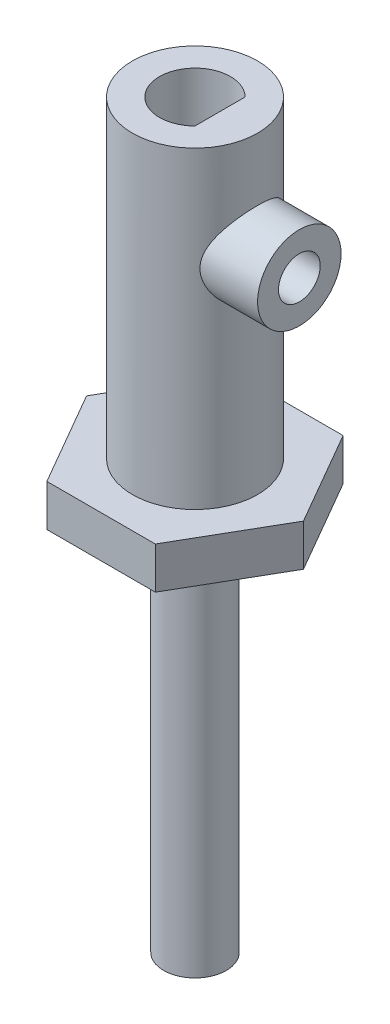
ISO-10303-21;
HEADER;
FILE_DESCRIPTION(('STEP AP214'),'2;1');
FILE_NAME('part.step','',(''),(''),'','','');
FILE_SCHEMA(('AUTOMOTIVE_DESIGN { 1 0 10303 214 1 1 1 1 }'));
ENDSEC;
DATA;
#1=APPLICATION_CONTEXT('core data for automotive mechanical design processes');
#2=APPLICATION_PROTOCOL_DEFINITION('international standard','automotive_design',2000,#1);
#3=PRODUCT_CONTEXT('',#1,'mechanical');
#4=PRODUCT('Part','Part','',(#3));
#5=PRODUCT_RELATED_PRODUCT_CATEGORY('part','',(#4));
#6=PRODUCT_DEFINITION_FORMATION('','',#4);
#7=PRODUCT_DEFINITION_CONTEXT('part definition',#1,'design');
#8=PRODUCT_DEFINITION('design','',#6,#7);
#9=PRODUCT_DEFINITION_SHAPE('','',#8);
#10=(LENGTH_UNIT() NAMED_UNIT(*) SI_UNIT(.MILLI.,.METRE.));
#11=(NAMED_UNIT(*) PLANE_ANGLE_UNIT() SI_UNIT($,.RADIAN.));
#12=(NAMED_UNIT(*) SI_UNIT($,.STERADIAN.) SOLID_ANGLE_UNIT());
#13=UNCERTAINTY_MEASURE_WITH_UNIT(LENGTH_MEASURE(1.E-05),#10,'distance_accuracy_value','');
#14=(GEOMETRIC_REPRESENTATION_CONTEXT(3) GLOBAL_UNCERTAINTY_ASSIGNED_CONTEXT((#13)) GLOBAL_UNIT_ASSIGNED_CONTEXT((#10,
#11,#12)) REPRESENTATION_CONTEXT('',''));
#15=CARTESIAN_POINT('',(0.,0.,0.));
#16=DIRECTION('',(0.,0.,1.));
#17=DIRECTION('',(1.,0.,0.));
#18=AXIS2_PLACEMENT_3D('',#15,#16,#17);
#19=CARTESIAN_POINT('',(0.,17.,0.));
#20=DIRECTION('',(0.,-1.,0.));
#21=DIRECTION('',(0.,0.,-1.));
#22=AXIS2_PLACEMENT_3D('',#19,#20,#21);
#23=CYLINDRICAL_SURFACE('',#22,3.);
#24=CARTESIAN_POINT('',(2.23606797749979,12.,-2.));
#25=CARTESIAN_POINT('',(2.23607753462817,11.9023716891314,-1.99999453997731));
#26=CARTESIAN_POINT('',(2.24258071047442,11.8047092462912,-1.99278992503664));
#27=CARTESIAN_POINT('',(2.26731972501617,11.6128800883492,-1.96458268317731));
#28=CARTESIAN_POINT('',(2.2855766081271,11.5187199644704,-1.94355530587862));
#29=CARTESIAN_POINT('',(2.3305658582557,11.3372645581223,-1.88935861676632));
#30=CARTESIAN_POINT('',(2.35721561794602,11.2499123032623,-1.85630718014214));
#31=CARTESIAN_POINT('',(2.41584094681825,11.0821341676533,-1.77934008393538));
#32=CARTESIAN_POINT('',(2.44781762158831,11.0017097300235,-1.73542216812163));
#33=CARTESIAN_POINT('',(2.51946072932026,10.8363531123831,-1.63002410007714));
#34=CARTESIAN_POINT('',(2.55954936090364,10.7526678822828,-1.56687435451732));
#35=CARTESIAN_POINT('',(2.63944827308083,10.5959972911257,-1.4281921974068));
#36=CARTESIAN_POINT('',(2.67925824297985,10.5230224783415,-1.3526477317708));
#37=CARTESIAN_POINT('',(2.76088818523747,10.3793563412183,-1.17815690494295));
#38=CARTESIAN_POINT('',(2.80216785846923,10.3105174882243,-1.07740643965819));
#39=CARTESIAN_POINT('',(2.87558484482764,10.1913579045099,-0.862470964212232));
#40=CARTESIAN_POINT('',(2.90773236231037,10.1410164859688,-0.748301152321704));
#41=CARTESIAN_POINT('',(2.95599907464725,10.0664435989825,-0.523249073480004));
#42=CARTESIAN_POINT('',(2.97351175615867,10.0399166555044,-0.413434725181417));
#43=CARTESIAN_POINT('',(2.99609745461921,10.0058155107164,-0.189695448729863));
#44=CARTESIAN_POINT('',(3.00118613762359,9.99821744077456,-0.075775881285826));
#45=CARTESIAN_POINT('',(2.99855361722953,10.0021724499491,0.134147050232329));
#46=CARTESIAN_POINT('',(2.99266264910127,10.0109890513171,0.230240638008752));
#47=CARTESIAN_POINT('',(2.9720818279002,10.0420910513589,0.419238633271014));
#48=CARTESIAN_POINT('',(2.95739133313102,10.0643774323035,0.512142807649723));
#49=CARTESIAN_POINT('',(2.92052091703736,10.1211956847946,0.692077937671168));
#50=CARTESIAN_POINT('',(2.89837077982679,10.1556788851986,0.77913062384596));
#51=CARTESIAN_POINT('',(2.84821104476288,10.2355536429528,0.946209150653555));
#52=CARTESIAN_POINT('',(2.82020037745161,10.2809471915015,1.0262337049694));
#53=CARTESIAN_POINT('',(2.75618058450702,10.3879787374599,1.18828429196344));
#54=CARTESIAN_POINT('',(2.71960408792025,10.4509675233528,1.26919148099708));
#55=CARTESIAN_POINT('',(2.64400601826998,10.5878986794803,1.41998807498304));
#56=CARTESIAN_POINT('',(2.60498072815232,10.6618579459338,1.48986013519457));
#57=CARTESIAN_POINT('',(2.52150044944152,10.8319632102133,1.62772235326165));
#58=CARTESIAN_POINT('',(2.47714320008932,10.9297710797145,1.69373593126354));
#59=CARTESIAN_POINT('',(2.39475610831096,11.1375098392207,1.80834874945482));
#60=CARTESIAN_POINT('',(2.3567157153489,11.2474199944139,1.85697718654898));
#61=CARTESIAN_POINT('',(2.30262870306889,11.4447190620731,1.92332724567776));
#62=CARTESIAN_POINT('',(2.28340364577668,11.5295933700569,1.94590791747533));
#63=CARTESIAN_POINT('',(2.25409039789612,11.7030394898168,1.97979555580014));
#64=CARTESIAN_POINT('',(2.24398636782354,11.7916046111726,1.99112206964395));
#65=CARTESIAN_POINT('',(2.23447556987372,11.9704429864415,2.00179400148877));
#66=CARTESIAN_POINT('',(2.2351153386647,12.0607219785201,2.00108729753098));
#67=CARTESIAN_POINT('',(2.24709880368953,12.239683833955,1.98761629716365));
#68=CARTESIAN_POINT('',(2.25845117648851,12.3283653441074,1.97484222690381));
#69=CARTESIAN_POINT('',(2.28927977500747,12.4973894175498,1.93899811187046));
#70=CARTESIAN_POINT('',(2.30833187069749,12.5779277090026,1.91646174529973));
#71=CARTESIAN_POINT('',(2.3522995853365,12.7341262360503,1.86223041628513));
#72=CARTESIAN_POINT('',(2.3772171729463,12.809784822963,1.83053237805351));
#73=CARTESIAN_POINT('',(2.43611483596194,12.9702020038475,1.75163346599563));
#74=CARTESIAN_POINT('',(2.47091081434316,13.0537568115427,1.70260028818246));
#75=CARTESIAN_POINT('',(2.54262514806634,13.2124168026173,1.59352731501438));
#76=CARTESIAN_POINT('',(2.57954604947543,13.2875115167425,1.53347411883827));
#77=CARTESIAN_POINT('',(2.66075678321007,13.4439623474675,1.38876657712435));
#78=CARTESIAN_POINT('',(2.70489452138573,13.5231028482483,1.30160386514207));
#79=CARTESIAN_POINT('',(2.78775581841638,13.6658166829403,1.11309948866219));
#80=CARTESIAN_POINT('',(2.82648414789457,13.7294037712567,1.011770477457));
#81=CARTESIAN_POINT('',(2.88790821242222,13.8278917389176,0.817487474821797));
#82=CARTESIAN_POINT('',(2.91225458111008,13.8659565044404,0.726662364886321));
#83=CARTESIAN_POINT('',(2.95278707867041,13.9286071943204,0.538757079020515));
#84=CARTESIAN_POINT('',(2.96898009871993,13.9532045028598,0.441682263858769));
#85=CARTESIAN_POINT('',(2.99178364026746,13.9876969638388,0.243369392303442));
#86=CARTESIAN_POINT('',(2.99835150856533,13.9975266795067,0.142114836924317));
#87=CARTESIAN_POINT('',(3.00109821029056,14.0016478514171,-0.0608555465807329));
#88=CARTESIAN_POINT('',(2.99727800938901,13.9959407519562,-0.162571330953448));
#89=CARTESIAN_POINT('',(2.98029555977324,13.9703405109953,-0.355757532528106));
#90=CARTESIAN_POINT('',(2.96783277209856,13.9515090151382,-0.447435143070531));
#91=CARTESIAN_POINT('',(2.93536106206933,13.9017619905691,-0.626018422997062));
#92=CARTESIAN_POINT('',(2.91535096747103,13.8708445846527,-0.71292334868689));
#93=CARTESIAN_POINT('',(2.86791765486194,13.796061295116,-0.885147296608352));
#94=CARTESIAN_POINT('',(2.84013248946338,13.7515496925049,-0.970083589200266));
#95=CARTESIAN_POINT('',(2.77975408235472,13.651849355374,-1.13155266268318));
#96=CARTESIAN_POINT('',(2.74715796645263,13.596654232048,-1.20808037205002));
#97=CARTESIAN_POINT('',(2.67392931472394,13.4673710976637,-1.36329422201402));
#98=CARTESIAN_POINT('',(2.6328391387737,13.391676976326,-1.44042679526091));
#99=CARTESIAN_POINT('',(2.55053357649486,13.2288864584542,-1.58160022281596));
#100=CARTESIAN_POINT('',(2.50931811970154,13.1417816111659,-1.64563128323923));
#101=CARTESIAN_POINT('',(2.43384213590298,12.9641324092447,-1.75513253518411));
#102=CARTESIAN_POINT('',(2.39929086741904,12.8743581900497,-1.8016464689721));
#103=CARTESIAN_POINT('',(2.33747501591023,12.6867155510068,-1.88115802340272));
#104=CARTESIAN_POINT('',(2.31019631295305,12.5888633061378,-1.91418190281333));
#105=CARTESIAN_POINT('',(2.27191051929539,12.4092285315755,-1.95936262470908));
#106=CARTESIAN_POINT('',(2.25863695410151,12.3286917632097,-1.97452228373248));
#107=CARTESIAN_POINT('',(2.24071519216009,12.1654435994955,-1.99483915818926));
#108=CARTESIAN_POINT('',(2.23605987841475,12.0827340557394,-2.00000462703715));
#109=CARTESIAN_POINT('',(2.23606797749979,12.,-2.));
#110=B_SPLINE_CURVE_WITH_KNOTS('',3,(#24,#25,#26,#27,#28,#29,#30,#31,#32,#33,#34,#35,#36,#37,
#38,#39,#40,#41,#42,#43,#44,#45,#46,#47,#48,#49,#50,#51,#52,#53,#54,#55,#56,#57,#58,#59,#60,#61,
#62,#63,#64,#65,#66,#67,#68,#69,#70,#71,#72,#73,#74,#75,#76,#77,#78,#79,#80,#81,#82,#83,#84,#85,
#86,#87,#88,#89,#90,#91,#92,#93,#94,#95,#96,#97,#98,#99,#100,#101,#102,#103,#104,#105,#106,#107,
#108,#109),.UNSPECIFIED.,.T.,.F.,(4,2,2,2,2,2,2,2,2,2,2,2,2,2,2,2,2,2,2,2,2,2,2,2,2,2,2,2,2,2,2,
2,2,2,2,2,2,2,2,2,2,2,4),(0.,0.292506930722154,0.585539042259288,0.875772651216272,
1.16606657266549,1.50154677068638,1.83735518436276,2.22167031006289,2.6055542938858,
2.94637482063579,3.28676536688298,3.57539534955742,3.86404638283746,4.15155831973191,
4.43912276903,4.76447525946635,5.09033414796638,5.46678703504943,5.84260469743948,
6.11126090401324,6.37944966235486,6.64880037638036,6.91836943570597,7.17476451706936,
7.43124577644957,7.73899230052352,8.04711556801509,8.42254684520963,8.7976449057258,
9.10070580611698,9.40351012888472,9.70765229266164,10.0117661844615,10.2937678224973,
10.5758132789284,10.874178629859,11.1727229593109,11.5182220628451,11.863978504186,
12.1833412579672,12.5020793664923,12.7501661630426,12.9980479966543),.UNSPECIFIED.);
#111=CARTESIAN_POINT('',(2.23606797749979,12.,-2.));
#112=VERTEX_POINT('',#111);
#113=EDGE_CURVE('E184',#112,#112,#110,.T.);
#114=ORIENTED_EDGE('',*,*,#113,.T.);
#115=EDGE_LOOP('',(#114));
#116=FACE_BOUND('',#115,.T.);
#117=CARTESIAN_POINT('',(0.,17.,0.));
#118=DIRECTION('',(0.,1.,0.));
#119=DIRECTION('',(0.,0.,1.));
#120=AXIS2_PLACEMENT_3D('',#117,#118,#119);
#121=CIRCLE('',#120,3.);
#122=CARTESIAN_POINT('',(0.,17.,3.));
#123=VERTEX_POINT('',#122);
#124=EDGE_CURVE('E179',#123,#123,#121,.T.);
#125=ORIENTED_EDGE('',*,*,#124,.F.);
#126=EDGE_LOOP('',(#125));
#127=FACE_BOUND('',#126,.T.);
#128=CARTESIAN_POINT('',(0.,2.,0.));
#129=DIRECTION('',(0.,-1.,0.));
#130=DIRECTION('',(0.,0.,-1.));
#131=AXIS2_PLACEMENT_3D('',#128,#129,#130);
#132=CIRCLE('',#131,3.);
#133=CARTESIAN_POINT('',(0.,2.,-3.));
#134=VERTEX_POINT('',#133);
#135=EDGE_CURVE('E43',#134,#134,#132,.T.);
#136=ORIENTED_EDGE('',*,*,#135,.F.);
#137=EDGE_LOOP('',(#136));
#138=FACE_BOUND('',#137,.T.);
#139=ADVANCED_FACE('F34',(#116,#127,#138),#23,.T.);
#140=CARTESIAN_POINT('',(0.,17.,0.));
#141=DIRECTION('',(0.,1.,0.));
#142=DIRECTION('',(0.,0.,1.));
#143=AXIS2_PLACEMENT_3D('',#140,#141,#142);
#144=PLANE('',#143);
#145=CARTESIAN_POINT('',(0.,17.,0.));
#146=DIRECTION('',(0.,1.,0.));
#147=DIRECTION('',(0.,0.,1.));
#148=AXIS2_PLACEMENT_3D('',#145,#146,#147);
#149=CIRCLE('',#148,1.7);
#150=CARTESIAN_POINT('',(1.2,17.,-1.20415945787923));
#151=VERTEX_POINT('',#150);
#152=CARTESIAN_POINT('',(1.2,17.,1.20415945787923));
#153=VERTEX_POINT('',#152);
#154=EDGE_CURVE('E51',#151,#153,#149,.T.);
#155=ORIENTED_EDGE('',*,*,#154,.F.);
#156=DIRECTION('',(0.,0.,-1.));
#157=VECTOR('',#156,1.);
#158=CARTESIAN_POINT('',(1.2,17.,-1.20415945787923));
#159=LINE('',#158,#157);
#160=EDGE_CURVE('E172',#153,#151,#159,.T.);
#161=ORIENTED_EDGE('',*,*,#160,.F.);
#162=EDGE_LOOP('',(#155,#161));
#163=FACE_BOUND('',#162,.T.);
#164=ORIENTED_EDGE('',*,*,#124,.T.);
#165=EDGE_LOOP('',(#164));
#166=FACE_BOUND('',#165,.T.);
#167=ADVANCED_FACE('F239',(#163,#166),#144,.T.);
#168=CARTESIAN_POINT('',(0.,6.8,0.));
#169=DIRECTION('',(0.,1.,0.));
#170=DIRECTION('',(0.,0.,1.));
#171=AXIS2_PLACEMENT_3D('',#168,#169,#170);
#172=CYLINDRICAL_SURFACE('',#171,1.7);
#173=ORIENTED_EDGE('',*,*,#154,.T.);
#174=DIRECTION('',(0.,1.,0.));
#175=VECTOR('',#174,1.);
#176=CARTESIAN_POINT('',(1.2,6.8,1.20415945787923));
#177=LINE('',#176,#175);
#178=CARTESIAN_POINT('',(1.2,6.8,1.20415945787923));
#179=VERTEX_POINT('',#178);
#180=EDGE_CURVE('E175',#179,#153,#177,.T.);
#181=ORIENTED_EDGE('',*,*,#180,.F.);
#182=CARTESIAN_POINT('',(0.,6.8,0.));
#183=DIRECTION('',(0.,1.,0.));
#184=DIRECTION('',(0.,0.,1.));
#185=AXIS2_PLACEMENT_3D('',#182,#183,#184);
#186=CIRCLE('',#185,1.7);
#187=CARTESIAN_POINT('',(1.2,6.8,-1.20415945787923));
#188=VERTEX_POINT('',#187);
#189=EDGE_CURVE('E168',#188,#179,#186,.T.);
#190=ORIENTED_EDGE('',*,*,#189,.F.);
#191=DIRECTION('',(0.,1.,0.));
#192=VECTOR('',#191,1.);
#193=CARTESIAN_POINT('',(1.2,6.8,-1.20415945787923));
#194=LINE('',#193,#192);
#195=EDGE_CURVE('E59',#188,#151,#194,.T.);
#196=ORIENTED_EDGE('',*,*,#195,.T.);
#197=EDGE_LOOP('',(#173,#181,#190,#196));
#198=FACE_BOUND('',#197,.T.);
#199=ADVANCED_FACE('F235',(#198),#172,.F.);
#200=CARTESIAN_POINT('',(1.2,6.8,-1.20415945787923));
#201=DIRECTION('',(1.,0.,0.));
#202=DIRECTION('',(0.,0.,-1.));
#203=AXIS2_PLACEMENT_3D('',#200,#201,#202);
#204=PLANE('',#203);
#205=CARTESIAN_POINT('',(1.2,12.,0.));
#206=DIRECTION('',(1.,0.,0.));
#207=DIRECTION('',(0.,0.,-1.));
#208=AXIS2_PLACEMENT_3D('',#205,#206,#207);
#209=CIRCLE('',#208,1.1);
#210=CARTESIAN_POINT('',(1.2,12.,-1.1));
#211=VERTEX_POINT('',#210);
#212=EDGE_CURVE('E38',#211,#211,#209,.T.);
#213=ORIENTED_EDGE('',*,*,#212,.T.);
#214=EDGE_LOOP('',(#213));
#215=FACE_BOUND('',#214,.T.);
#216=ORIENTED_EDGE('',*,*,#160,.T.);
#217=ORIENTED_EDGE('',*,*,#195,.F.);
#218=DIRECTION('',(0.,0.,-1.));
#219=VECTOR('',#218,1.);
#220=CARTESIAN_POINT('',(1.2,6.8,-1.20415945787923));
#221=LINE('',#220,#219);
#222=EDGE_CURVE('E171',#179,#188,#221,.T.);
#223=ORIENTED_EDGE('',*,*,#222,.F.);
#224=ORIENTED_EDGE('',*,*,#180,.T.);
#225=EDGE_LOOP('',(#216,#217,#223,#224));
#226=FACE_BOUND('',#225,.T.);
#227=ADVANCED_FACE('F231',(#215,#226),#204,.F.);
#228=CARTESIAN_POINT('',(0.,6.8,0.));
#229=DIRECTION('',(0.,1.,0.));
#230=DIRECTION('',(0.,0.,1.));
#231=AXIS2_PLACEMENT_3D('',#228,#229,#230);
#232=PLANE('',#231);
#233=ORIENTED_EDGE('',*,*,#189,.T.);
#234=ORIENTED_EDGE('',*,*,#222,.T.);
#235=EDGE_LOOP('',(#233,#234));
#236=FACE_BOUND('',#235,.T.);
#237=ADVANCED_FACE('F228',(#236),#232,.T.);
#238=CARTESIAN_POINT('',(-2.59807621135332,2.,4.5));
#239=DIRECTION('',(-0.866025403784439,0.,0.5));
#240=DIRECTION('',(0.5,0.,0.866025403784439));
#241=AXIS2_PLACEMENT_3D('',#238,#239,#240);
#242=PLANE('',#241);
#243=DIRECTION('',(-0.5,0.,-0.866025403784439));
#244=VECTOR('',#243,1.);
#245=CARTESIAN_POINT('',(-2.59807621135332,0.,4.5));
#246=LINE('',#245,#244);
#247=CARTESIAN_POINT('',(-2.59807621135332,0.,4.5));
#248=VERTEX_POINT('',#247);
#249=CARTESIAN_POINT('',(-5.19615242270663,0.,0.));
#250=VERTEX_POINT('',#249);
#251=EDGE_CURVE('E145',#248,#250,#246,.T.);
#252=ORIENTED_EDGE('',*,*,#251,.F.);
#253=DIRECTION('',(0.,-1.,0.));
#254=VECTOR('',#253,1.);
#255=CARTESIAN_POINT('',(-2.59807621135332,2.,4.5));
#256=LINE('',#255,#254);
#257=CARTESIAN_POINT('',(-2.59807621135332,2.,4.5));
#258=VERTEX_POINT('',#257);
#259=EDGE_CURVE('E72',#258,#248,#256,.T.);
#260=ORIENTED_EDGE('',*,*,#259,.F.);
#261=DIRECTION('',(-0.5,0.,-0.866025403784439));
#262=VECTOR('',#261,1.);
#263=CARTESIAN_POINT('',(-2.59807621135332,2.,4.5));
#264=LINE('',#263,#262);
#265=CARTESIAN_POINT('',(-5.19615242270663,2.,0.));
#266=VERTEX_POINT('',#265);
#267=EDGE_CURVE('E161',#258,#266,#264,.T.);
#268=ORIENTED_EDGE('',*,*,#267,.T.);
#269=DIRECTION('',(0.,-1.,0.));
#270=VECTOR('',#269,1.);
#271=CARTESIAN_POINT('',(-5.19615242270663,2.,0.));
#272=LINE('',#271,#270);
#273=EDGE_CURVE('E104',#266,#250,#272,.T.);
#274=ORIENTED_EDGE('',*,*,#273,.T.);
#275=EDGE_LOOP('',(#252,#260,#268,#274));
#276=FACE_BOUND('',#275,.T.);
#277=ADVANCED_FACE('F215',(#276),#242,.T.);
#278=CARTESIAN_POINT('',(2.59807621135332,2.,4.5));
#279=DIRECTION('',(0.,0.,1.));
#280=DIRECTION('',(1.,0.,0.));
#281=AXIS2_PLACEMENT_3D('',#278,#279,#280);
#282=PLANE('',#281);
#283=DIRECTION('',(-1.,0.,0.));
#284=VECTOR('',#283,1.);
#285=CARTESIAN_POINT('',(2.59807621135332,0.,4.5));
#286=LINE('',#285,#284);
#287=CARTESIAN_POINT('',(2.59807621135332,0.,4.5));
#288=VERTEX_POINT('',#287);
#289=EDGE_CURVE('E158',#288,#248,#286,.T.);
#290=ORIENTED_EDGE('',*,*,#289,.F.);
#291=DIRECTION('',(0.,-1.,0.));
#292=VECTOR('',#291,1.);
#293=CARTESIAN_POINT('',(2.59807621135332,2.,4.5));
#294=LINE('',#293,#292);
#295=CARTESIAN_POINT('',(2.59807621135332,2.,4.5));
#296=VERTEX_POINT('',#295);
#297=EDGE_CURVE('E126',#296,#288,#294,.T.);
#298=ORIENTED_EDGE('',*,*,#297,.F.);
#299=DIRECTION('',(-1.,0.,0.));
#300=VECTOR('',#299,1.);
#301=CARTESIAN_POINT('',(2.59807621135332,2.,4.5));
#302=LINE('',#301,#300);
#303=EDGE_CURVE('E135',#296,#258,#302,.T.);
#304=ORIENTED_EDGE('',*,*,#303,.T.);
#305=ORIENTED_EDGE('',*,*,#259,.T.);
#306=EDGE_LOOP('',(#290,#298,#304,#305));
#307=FACE_BOUND('',#306,.T.);
#308=ADVANCED_FACE('F212',(#307),#282,.T.);
#309=CARTESIAN_POINT('',(5.19615242270663,2.,0.));
#310=DIRECTION('',(0.866025403784438,0.,0.5));
#311=DIRECTION('',(0.5,0.,-0.866025403784439));
#312=AXIS2_PLACEMENT_3D('',#309,#310,#311);
#313=PLANE('',#312);
#314=DIRECTION('',(-0.5,0.,0.866025403784438));
#315=VECTOR('',#314,1.);
#316=CARTESIAN_POINT('',(5.19615242270663,0.,0.));
#317=LINE('',#316,#315);
#318=CARTESIAN_POINT('',(5.19615242270663,0.,0.));
#319=VERTEX_POINT('',#318);
#320=EDGE_CURVE('E121',#319,#288,#317,.T.);
#321=ORIENTED_EDGE('',*,*,#320,.F.);
#322=DIRECTION('',(0.,-1.,0.));
#323=VECTOR('',#322,1.);
#324=CARTESIAN_POINT('',(5.19615242270663,2.,0.));
#325=LINE('',#324,#323);
#326=CARTESIAN_POINT('',(5.19615242270663,2.,0.));
#327=VERTEX_POINT('',#326);
#328=EDGE_CURVE('E115',#327,#319,#325,.T.);
#329=ORIENTED_EDGE('',*,*,#328,.F.);
#330=DIRECTION('',(-0.5,0.,0.866025403784438));
#331=VECTOR('',#330,1.);
#332=CARTESIAN_POINT('',(5.19615242270663,2.,0.));
#333=LINE('',#332,#331);
#334=EDGE_CURVE('E118',#327,#296,#333,.T.);
#335=ORIENTED_EDGE('',*,*,#334,.T.);
#336=ORIENTED_EDGE('',*,*,#297,.T.);
#337=EDGE_LOOP('',(#321,#329,#335,#336));
#338=FACE_BOUND('',#337,.T.);
#339=ADVANCED_FACE('F117',(#338),#313,.T.);
#340=CARTESIAN_POINT('',(2.59807621135332,2.,-4.5));
#341=DIRECTION('',(0.866025403784439,0.,-0.5));
#342=DIRECTION('',(-0.5,0.,-0.866025403784439));
#343=AXIS2_PLACEMENT_3D('',#340,#341,#342);
#344=PLANE('',#343);
#345=DIRECTION('',(0.5,0.,0.866025403784439));
#346=VECTOR('',#345,1.);
#347=CARTESIAN_POINT('',(2.59807621135332,0.,-4.5));
#348=LINE('',#347,#346);
#349=CARTESIAN_POINT('',(2.59807621135332,0.,-4.5));
#350=VERTEX_POINT('',#349);
#351=EDGE_CURVE('E155',#350,#319,#348,.T.);
#352=ORIENTED_EDGE('',*,*,#351,.F.);
#353=DIRECTION('',(0.,-1.,0.));
#354=VECTOR('',#353,1.);
#355=CARTESIAN_POINT('',(2.59807621135332,2.,-4.5));
#356=LINE('',#355,#354);
#357=CARTESIAN_POINT('',(2.59807621135332,2.,-4.5));
#358=VERTEX_POINT('',#357);
#359=EDGE_CURVE('E127',#358,#350,#356,.T.);
#360=ORIENTED_EDGE('',*,*,#359,.F.);
#361=DIRECTION('',(0.5,0.,0.866025403784439));
#362=VECTOR('',#361,1.);
#363=CARTESIAN_POINT('',(2.59807621135332,2.,-4.5));
#364=LINE('',#363,#362);
#365=EDGE_CURVE('E133',#358,#327,#364,.T.);
#366=ORIENTED_EDGE('',*,*,#365,.T.);
#367=ORIENTED_EDGE('',*,*,#328,.T.);
#368=EDGE_LOOP('',(#352,#360,#366,#367));
#369=FACE_BOUND('',#368,.T.);
#370=ADVANCED_FACE('F137',(#369),#344,.T.);
#371=CARTESIAN_POINT('',(-2.59807621135332,2.,-4.5));
#372=DIRECTION('',(0.,0.,-1.));
#373=DIRECTION('',(-1.,0.,0.));
#374=AXIS2_PLACEMENT_3D('',#371,#372,#373);
#375=PLANE('',#374);
#376=DIRECTION('',(1.,0.,0.));
#377=VECTOR('',#376,1.);
#378=CARTESIAN_POINT('',(-2.59807621135332,0.,-4.5));
#379=LINE('',#378,#377);
#380=CARTESIAN_POINT('',(-2.59807621135332,0.,-4.5));
#381=VERTEX_POINT('',#380);
#382=EDGE_CURVE('E152',#381,#350,#379,.T.);
#383=ORIENTED_EDGE('',*,*,#382,.F.);
#384=DIRECTION('',(0.,-1.,0.));
#385=VECTOR('',#384,1.);
#386=CARTESIAN_POINT('',(-2.59807621135332,2.,-4.5));
#387=LINE('',#386,#385);
#388=CARTESIAN_POINT('',(-2.59807621135332,2.,-4.5));
#389=VERTEX_POINT('',#388);
#390=EDGE_CURVE('E165',#389,#381,#387,.T.);
#391=ORIENTED_EDGE('',*,*,#390,.F.);
#392=DIRECTION('',(1.,0.,0.));
#393=VECTOR('',#392,1.);
#394=CARTESIAN_POINT('',(-2.59807621135332,2.,-4.5));
#395=LINE('',#394,#393);
#396=EDGE_CURVE('E138',#389,#358,#395,.T.);
#397=ORIENTED_EDGE('',*,*,#396,.T.);
#398=ORIENTED_EDGE('',*,*,#359,.T.);
#399=EDGE_LOOP('',(#383,#391,#397,#398));
#400=FACE_BOUND('',#399,.T.);
#401=ADVANCED_FACE('F220',(#400),#375,.T.);
#402=CARTESIAN_POINT('',(-5.19615242270663,2.,0.));
#403=DIRECTION('',(-0.866025403784439,0.,-0.5));
#404=DIRECTION('',(-0.5,0.,0.866025403784439));
#405=AXIS2_PLACEMENT_3D('',#402,#403,#404);
#406=PLANE('',#405);
#407=DIRECTION('',(0.5,0.,-0.866025403784439));
#408=VECTOR('',#407,1.);
#409=CARTESIAN_POINT('',(-5.19615242270663,0.,0.));
#410=LINE('',#409,#408);
#411=EDGE_CURVE('E148',#250,#381,#410,.T.);
#412=ORIENTED_EDGE('',*,*,#411,.F.);
#413=ORIENTED_EDGE('',*,*,#273,.F.);
#414=DIRECTION('',(0.5,0.,-0.866025403784439));
#415=VECTOR('',#414,1.);
#416=CARTESIAN_POINT('',(-5.19615242270663,2.,0.));
#417=LINE('',#416,#415);
#418=EDGE_CURVE('E140',#266,#389,#417,.T.);
#419=ORIENTED_EDGE('',*,*,#418,.T.);
#420=ORIENTED_EDGE('',*,*,#390,.T.);
#421=EDGE_LOOP('',(#412,#413,#419,#420));
#422=FACE_BOUND('',#421,.T.);
#423=ADVANCED_FACE('F210',(#422),#406,.T.);
#424=CARTESIAN_POINT('',(0.,2.,0.));
#425=DIRECTION('',(0.,-1.,0.));
#426=DIRECTION('',(0.,0.,-1.));
#427=AXIS2_PLACEMENT_3D('',#424,#425,#426);
#428=PLANE('',#427);
#429=ORIENTED_EDGE('',*,*,#135,.T.);
#430=EDGE_LOOP('',(#429));
#431=FACE_BOUND('',#430,.T.);
#432=ORIENTED_EDGE('',*,*,#267,.F.);
#433=ORIENTED_EDGE('',*,*,#303,.F.);
#434=ORIENTED_EDGE('',*,*,#334,.F.);
#435=ORIENTED_EDGE('',*,*,#365,.F.);
#436=ORIENTED_EDGE('',*,*,#396,.F.);
#437=ORIENTED_EDGE('',*,*,#418,.F.);
#438=EDGE_LOOP('',(#432,#433,#434,#435,#436,#437));
#439=FACE_BOUND('',#438,.T.);
#440=ADVANCED_FACE('F131',(#431,#439),#428,.F.);
#441=CARTESIAN_POINT('',(0.,0.,0.));
#442=DIRECTION('',(0.,1.,0.));
#443=DIRECTION('',(0.,0.,1.));
#444=AXIS2_PLACEMENT_3D('',#441,#442,#443);
#445=PLANE('',#444);
#446=CARTESIAN_POINT('',(0.,0.,0.));
#447=DIRECTION('',(0.,-1.,0.));
#448=DIRECTION('',(0.,0.,-1.));
#449=AXIS2_PLACEMENT_3D('',#446,#447,#448);
#450=CIRCLE('',#449,1.5);
#451=CARTESIAN_POINT('',(0.,0.,-1.5));
#452=VERTEX_POINT('',#451);
#453=EDGE_CURVE('E11',#452,#452,#450,.T.);
#454=ORIENTED_EDGE('',*,*,#453,.F.);
#455=EDGE_LOOP('',(#454));
#456=FACE_BOUND('',#455,.T.);
#457=ORIENTED_EDGE('',*,*,#251,.T.);
#458=ORIENTED_EDGE('',*,*,#411,.T.);
#459=ORIENTED_EDGE('',*,*,#382,.T.);
#460=ORIENTED_EDGE('',*,*,#351,.T.);
#461=ORIENTED_EDGE('',*,*,#320,.T.);
#462=ORIENTED_EDGE('',*,*,#289,.T.);
#463=EDGE_LOOP('',(#457,#458,#459,#460,#461,#462));
#464=FACE_BOUND('',#463,.T.);
#465=ADVANCED_FACE('F206',(#456,#464),#445,.F.);
#466=CARTESIAN_POINT('',(0.,-18.5,0.));
#467=DIRECTION('',(0.,1.,0.));
#468=DIRECTION('',(0.,0.,1.));
#469=AXIS2_PLACEMENT_3D('',#466,#467,#468);
#470=CYLINDRICAL_SURFACE('',#469,1.5);
#471=CARTESIAN_POINT('',(0.,-18.5,0.));
#472=DIRECTION('',(0.,-1.,0.));
#473=DIRECTION('',(0.,0.,-1.));
#474=AXIS2_PLACEMENT_3D('',#471,#472,#473);
#475=CIRCLE('',#474,1.5);
#476=CARTESIAN_POINT('',(0.,-18.5,-1.5));
#477=VERTEX_POINT('',#476);
#478=EDGE_CURVE('E149',#477,#477,#475,.T.);
#479=ORIENTED_EDGE('',*,*,#478,.F.);
#480=EDGE_LOOP('',(#479));
#481=FACE_BOUND('',#480,.T.);
#482=ORIENTED_EDGE('',*,*,#453,.T.);
#483=EDGE_LOOP('',(#482));
#484=FACE_BOUND('',#483,.T.);
#485=ADVANCED_FACE('F202',(#481,#484),#470,.T.);
#486=CARTESIAN_POINT('',(0.,-18.5,0.));
#487=DIRECTION('',(0.,-1.,0.));
#488=DIRECTION('',(0.,0.,-1.));
#489=AXIS2_PLACEMENT_3D('',#486,#487,#488);
#490=PLANE('',#489);
#491=ORIENTED_EDGE('',*,*,#478,.T.);
#492=EDGE_LOOP('',(#491));
#493=FACE_BOUND('',#492,.T.);
#494=ADVANCED_FACE('F197',(#493),#490,.T.);
#495=CARTESIAN_POINT('',(2.,12.,0.));
#496=DIRECTION('',(1.,0.,0.));
#497=DIRECTION('',(0.,0.,-1.));
#498=AXIS2_PLACEMENT_3D('',#495,#496,#497);
#499=CYLINDRICAL_SURFACE('',#498,2.);
#500=CARTESIAN_POINT('',(5.,12.,0.));
#501=DIRECTION('',(1.,0.,0.));
#502=DIRECTION('',(0.,0.,-1.));
#503=AXIS2_PLACEMENT_3D('',#500,#501,#502);
#504=CIRCLE('',#503,2.);
#505=CARTESIAN_POINT('',(5.,12.,-2.));
#506=VERTEX_POINT('',#505);
#507=EDGE_CURVE('E190',#506,#506,#504,.T.);
#508=ORIENTED_EDGE('',*,*,#507,.F.);
#509=EDGE_LOOP('',(#508));
#510=FACE_BOUND('',#509,.T.);
#511=ORIENTED_EDGE('',*,*,#113,.F.);
#512=EDGE_LOOP('',(#511));
#513=FACE_BOUND('',#512,.T.);
#514=ADVANCED_FACE('F191',(#510,#513),#499,.T.);
#515=CARTESIAN_POINT('',(2.,12.,0.));
#516=DIRECTION('',(1.,0.,0.));
#517=DIRECTION('',(0.,0.,-1.));
#518=AXIS2_PLACEMENT_3D('',#515,#516,#517);
#519=CYLINDRICAL_SURFACE('',#518,1.);
#520=CARTESIAN_POINT('',(5.,12.,0.));
#521=DIRECTION('',(1.,0.,0.));
#522=DIRECTION('',(0.,0.,-1.));
#523=AXIS2_PLACEMENT_3D('',#520,#521,#522);
#524=CIRCLE('',#523,1.);
#525=CARTESIAN_POINT('',(5.,12.,-1.));
#526=VERTEX_POINT('',#525);
#527=EDGE_CURVE('E377',#526,#526,#524,.T.);
#528=ORIENTED_EDGE('',*,*,#527,.T.);
#529=EDGE_LOOP('',(#528));
#530=FACE_BOUND('',#529,.T.);
#531=CARTESIAN_POINT('',(3.,12.,0.));
#532=DIRECTION('',(1.,0.,0.));
#533=DIRECTION('',(0.,0.,-1.));
#534=AXIS2_PLACEMENT_3D('',#531,#532,#533);
#535=CIRCLE('',#534,1.);
#536=CARTESIAN_POINT('',(3.,12.,-1.));
#537=VERTEX_POINT('',#536);
#538=EDGE_CURVE('E373',#537,#537,#535,.F.);
#539=ORIENTED_EDGE('',*,*,#538,.T.);
#540=EDGE_LOOP('',(#539));
#541=FACE_BOUND('',#540,.T.);
#542=ADVANCED_FACE('F196',(#530,#541),#519,.F.);
#543=CARTESIAN_POINT('',(5.,12.,0.));
#544=DIRECTION('',(1.,0.,0.));
#545=DIRECTION('',(0.,0.,-1.));
#546=AXIS2_PLACEMENT_3D('',#543,#544,#545);
#547=PLANE('',#546);
#548=ORIENTED_EDGE('',*,*,#507,.T.);
#549=EDGE_LOOP('',(#548));
#550=FACE_BOUND('',#549,.T.);
#551=ORIENTED_EDGE('',*,*,#527,.F.);
#552=EDGE_LOOP('',(#551));
#553=FACE_BOUND('',#552,.T.);
#554=ADVANCED_FACE('F333',(#550,#553),#547,.T.);
#555=CARTESIAN_POINT('',(0.,12.,0.));
#556=DIRECTION('',(1.,0.,0.));
#557=DIRECTION('',(0.,0.,-1.));
#558=AXIS2_PLACEMENT_3D('',#555,#556,#557);
#559=CYLINDRICAL_SURFACE('',#558,1.1);
#560=CARTESIAN_POINT('',(3.,12.,0.));
#561=DIRECTION('',(1.,0.,0.));
#562=DIRECTION('',(0.,0.,-1.));
#563=AXIS2_PLACEMENT_3D('',#560,#561,#562);
#564=CIRCLE('',#563,1.1);
#565=CARTESIAN_POINT('',(3.,12.,-1.1));
#566=VERTEX_POINT('',#565);
#567=EDGE_CURVE('E370',#566,#566,#564,.T.);
#568=ORIENTED_EDGE('',*,*,#567,.T.);
#569=EDGE_LOOP('',(#568));
#570=FACE_BOUND('',#569,.T.);
#571=ORIENTED_EDGE('',*,*,#212,.F.);
#572=EDGE_LOOP('',(#571));
#573=FACE_BOUND('',#572,.T.);
#574=ADVANCED_FACE('F340',(#570,#573),#559,.F.);
#575=CARTESIAN_POINT('',(3.,12.,0.));
#576=DIRECTION('',(1.,0.,0.));
#577=DIRECTION('',(0.,0.,-1.));
#578=AXIS2_PLACEMENT_3D('',#575,#576,#577);
#579=PLANE('',#578);
#580=ORIENTED_EDGE('',*,*,#567,.F.);
#581=EDGE_LOOP('',(#580));
#582=FACE_BOUND('',#581,.T.);
#583=ORIENTED_EDGE('',*,*,#538,.F.);
#584=EDGE_LOOP('',(#583));
#585=FACE_BOUND('',#584,.T.);
#586=ADVANCED_FACE('F346',(#582,#585),#579,.F.);
#587=CLOSED_SHELL('',(#139,#167,#199,#227,#237,#277,#308,#339,#370,#401,#423,#440,#465,#485,
#494,#514,#542,#554,#574,#586));
#588=MANIFOLD_SOLID_BREP('B2',#587);
#589=ADVANCED_BREP_SHAPE_REPRESENTATION('',(#18,#588),#14);
#590=SHAPE_DEFINITION_REPRESENTATION(#9,#589);
ENDSEC;
END-ISO-10303-21;
